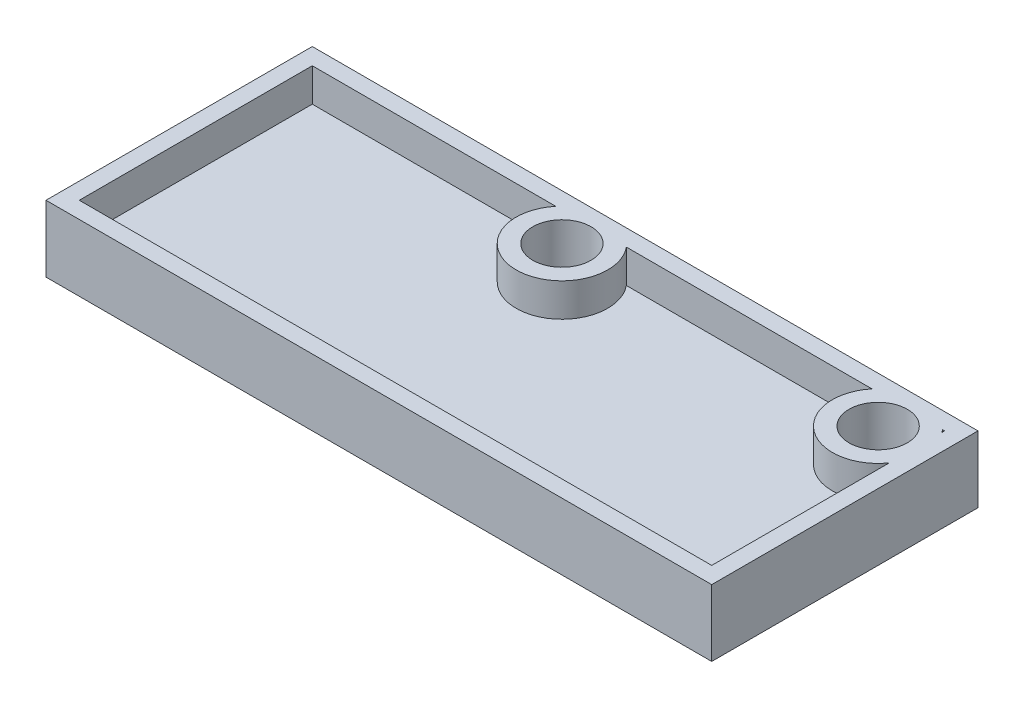
ISO-10303-21;
HEADER;
FILE_DESCRIPTION(('STEP AP214'),'2;1');
FILE_NAME('part.step','',(''),(''),'','','');
FILE_SCHEMA(('AUTOMOTIVE_DESIGN { 1 0 10303 214 1 1 1 1 }'));
ENDSEC;
DATA;
#1=APPLICATION_CONTEXT('core data for automotive mechanical design processes');
#2=APPLICATION_PROTOCOL_DEFINITION('international standard','automotive_design',2000,#1);
#3=PRODUCT_CONTEXT('',#1,'mechanical');
#4=PRODUCT('Part','Part','',(#3));
#5=PRODUCT_RELATED_PRODUCT_CATEGORY('part','',(#4));
#6=PRODUCT_DEFINITION_FORMATION('','',#4);
#7=PRODUCT_DEFINITION_CONTEXT('part definition',#1,'design');
#8=PRODUCT_DEFINITION('design','',#6,#7);
#9=PRODUCT_DEFINITION_SHAPE('','',#8);
#10=(LENGTH_UNIT() NAMED_UNIT(*) SI_UNIT(.MILLI.,.METRE.));
#11=(NAMED_UNIT(*) PLANE_ANGLE_UNIT() SI_UNIT($,.RADIAN.));
#12=(NAMED_UNIT(*) SI_UNIT($,.STERADIAN.) SOLID_ANGLE_UNIT());
#13=UNCERTAINTY_MEASURE_WITH_UNIT(LENGTH_MEASURE(1.E-05),#10,'distance_accuracy_value','');
#14=(GEOMETRIC_REPRESENTATION_CONTEXT(3) GLOBAL_UNCERTAINTY_ASSIGNED_CONTEXT((#13)) GLOBAL_UNIT_ASSIGNED_CONTEXT((#10,
#11,#12)) REPRESENTATION_CONTEXT('',''));
#15=CARTESIAN_POINT('',(0.,0.,0.));
#16=DIRECTION('',(0.,0.,1.));
#17=DIRECTION('',(1.,0.,0.));
#18=AXIS2_PLACEMENT_3D('',#15,#16,#17);
#19=CARTESIAN_POINT('',(1.,4.,-15.));
#20=DIRECTION('',(0.,0.,1.));
#21=DIRECTION('',(1.,0.,0.));
#22=AXIS2_PLACEMENT_3D('',#19,#20,#21);
#23=PLANE('',#22);
#24=DIRECTION('',(0.,1.,0.));
#25=VECTOR('',#24,1.);
#26=CARTESIAN_POINT('',(38.8713203435597,-0.00200000000000027,-15.));
#27=LINE('',#26,#25);
#28=CARTESIAN_POINT('',(38.8713203435597,2.,-15.));
#29=VERTEX_POINT('',#28);
#30=CARTESIAN_POINT('',(38.8713203435597,4.,-15.));
#31=VERTEX_POINT('',#30);
#32=EDGE_CURVE('E203',#29,#31,#27,.T.);
#33=ORIENTED_EDGE('',*,*,#32,.F.);
#34=DIRECTION('',(-1.,0.,0.));
#35=VECTOR('',#34,1.);
#36=CARTESIAN_POINT('',(1.,2.,-15.));
#37=LINE('',#36,#35);
#38=CARTESIAN_POINT('',(39.,2.,-15.));
#39=VERTEX_POINT('',#38);
#40=EDGE_CURVE('E217',#39,#29,#37,.T.);
#41=ORIENTED_EDGE('',*,*,#40,.F.);
#42=DIRECTION('',(0.,-1.,0.));
#43=VECTOR('',#42,1.);
#44=CARTESIAN_POINT('',(39.,4.,-15.));
#45=LINE('',#44,#43);
#46=CARTESIAN_POINT('',(39.,4.,-15.));
#47=VERTEX_POINT('',#46);
#48=EDGE_CURVE('E241',#47,#39,#45,.T.);
#49=ORIENTED_EDGE('',*,*,#48,.F.);
#50=DIRECTION('',(-1.,0.,0.));
#51=VECTOR('',#50,1.);
#52=CARTESIAN_POINT('',(1.,4.,-15.));
#53=LINE('',#52,#51);
#54=EDGE_CURVE('E219',#47,#31,#53,.T.);
#55=ORIENTED_EDGE('',*,*,#54,.T.);
#56=EDGE_LOOP('',(#33,#41,#49,#55));
#57=FACE_BOUND('',#56,.T.);
#58=ADVANCED_FACE('F96',(#57),#23,.T.);
#59=CARTESIAN_POINT('',(39.,4.,-0.999999999999999));
#60=DIRECTION('',(-1.,0.,0.));
#61=DIRECTION('',(0.,0.,1.));
#62=AXIS2_PLACEMENT_3D('',#59,#60,#61);
#63=PLANE('',#62);
#64=DIRECTION('',(0.,1.,0.));
#65=VECTOR('',#64,1.);
#66=CARTESIAN_POINT('',(39.,-0.00200000000000027,-11.6688611699158));
#67=LINE('',#66,#65);
#68=CARTESIAN_POINT('',(39.,2.,-11.6688611699158));
#69=VERTEX_POINT('',#68);
#70=CARTESIAN_POINT('',(39.,4.,-11.6688611699158));
#71=VERTEX_POINT('',#70);
#72=EDGE_CURVE('E374',#69,#71,#67,.T.);
#73=ORIENTED_EDGE('',*,*,#72,.F.);
#74=DIRECTION('',(0.,0.,-1.));
#75=VECTOR('',#74,1.);
#76=CARTESIAN_POINT('',(39.,2.,-0.999999999999999));
#77=LINE('',#76,#75);
#78=CARTESIAN_POINT('',(39.,2.,-0.999999999999999));
#79=VERTEX_POINT('',#78);
#80=EDGE_CURVE('E234',#79,#69,#77,.T.);
#81=ORIENTED_EDGE('',*,*,#80,.F.);
#82=DIRECTION('',(0.,-1.,0.));
#83=VECTOR('',#82,1.);
#84=CARTESIAN_POINT('',(39.,4.,-0.999999999999999));
#85=LINE('',#84,#83);
#86=CARTESIAN_POINT('',(39.,4.,-0.999999999999999));
#87=VERTEX_POINT('',#86);
#88=EDGE_CURVE('E243',#87,#79,#85,.T.);
#89=ORIENTED_EDGE('',*,*,#88,.F.);
#90=DIRECTION('',(0.,0.,-1.));
#91=VECTOR('',#90,1.);
#92=CARTESIAN_POINT('',(39.,4.,-0.999999999999999));
#93=LINE('',#92,#91);
#94=EDGE_CURVE('E339',#87,#71,#93,.T.);
#95=ORIENTED_EDGE('',*,*,#94,.T.);
#96=EDGE_LOOP('',(#73,#81,#89,#95));
#97=FACE_BOUND('',#96,.T.);
#98=ADVANCED_FACE('F301',(#97),#63,.T.);
#99=CARTESIAN_POINT('',(0.,2.,0.));
#100=DIRECTION('',(0.,-1.,0.));
#101=DIRECTION('',(0.,0.,-1.));
#102=AXIS2_PLACEMENT_3D('',#99,#100,#101);
#103=PLANE('',#102);
#104=ORIENTED_EDGE('',*,*,#40,.T.);
#105=CARTESIAN_POINT('',(36.75,2.,-13.25));
#106=DIRECTION('',(0.,-1.,0.));
#107=DIRECTION('',(0.,0.,-1.));
#108=AXIS2_PLACEMENT_3D('',#105,#106,#107);
#109=CIRCLE('',#108,2.74999999999999);
#110=CARTESIAN_POINT('',(39.,2.,-14.8311388300842));
#111=VERTEX_POINT('',#110);
#112=EDGE_CURVE('E200',#111,#29,#109,.F.);
#113=ORIENTED_EDGE('',*,*,#112,.F.);
#114=EDGE_CURVE('E223',#111,#39,#77,.T.);
#115=ORIENTED_EDGE('',*,*,#114,.T.);
#116=EDGE_LOOP('',(#104,#113,#115));
#117=FACE_BOUND('',#116,.T.);
#118=ADVANCED_FACE('F222',(#117),#103,.F.);
#119=DIRECTION('',(0.,1.,0.));
#120=VECTOR('',#119,1.);
#121=CARTESIAN_POINT('',(34.6286796564404,-0.00200000000000027,-15.));
#122=LINE('',#121,#120);
#123=CARTESIAN_POINT('',(34.6286796564404,4.,-15.));
#124=VERTEX_POINT('',#123);
#125=CARTESIAN_POINT('',(34.6286796564404,2.,-15.));
#126=VERTEX_POINT('',#125);
#127=EDGE_CURVE('E114',#124,#126,#122,.F.);
#128=ORIENTED_EDGE('',*,*,#127,.F.);
#129=CARTESIAN_POINT('',(19.8713203435596,4.,-15.));
#130=VERTEX_POINT('',#129);
#131=EDGE_CURVE('E338',#124,#130,#53,.T.);
#132=ORIENTED_EDGE('',*,*,#131,.T.);
#133=DIRECTION('',(0.,1.,0.));
#134=VECTOR('',#133,1.);
#135=CARTESIAN_POINT('',(19.8713203435596,-0.00200000000000027,-15.));
#136=LINE('',#135,#134);
#137=CARTESIAN_POINT('',(19.8713203435596,2.,-15.));
#138=VERTEX_POINT('',#137);
#139=EDGE_CURVE('E329',#138,#130,#136,.T.);
#140=ORIENTED_EDGE('',*,*,#139,.F.);
#141=EDGE_CURVE('E100',#126,#138,#37,.T.);
#142=ORIENTED_EDGE('',*,*,#141,.F.);
#143=EDGE_LOOP('',(#128,#132,#140,#142));
#144=FACE_BOUND('',#143,.T.);
#145=ADVANCED_FACE('F299',(#144),#23,.T.);
#146=CARTESIAN_POINT('',(0.,2.,0.));
#147=DIRECTION('',(1.,0.,0.));
#148=DIRECTION('',(0.,0.,-1.));
#149=AXIS2_PLACEMENT_3D('',#146,#147,#148);
#150=PLANE('',#149);
#151=DIRECTION('',(0.,0.,1.));
#152=VECTOR('',#151,1.);
#153=CARTESIAN_POINT('',(0.,0.,0.));
#154=LINE('',#153,#152);
#155=CARTESIAN_POINT('',(0.,0.,-16.));
#156=VERTEX_POINT('',#155);
#157=CARTESIAN_POINT('',(0.,0.,0.));
#158=VERTEX_POINT('',#157);
#159=EDGE_CURVE('E259',#156,#158,#154,.T.);
#160=ORIENTED_EDGE('',*,*,#159,.T.);
#161=DIRECTION('',(0.,-1.,0.));
#162=VECTOR('',#161,1.);
#163=CARTESIAN_POINT('',(0.,2.,0.));
#164=LINE('',#163,#162);
#165=CARTESIAN_POINT('',(0.,4.,0.));
#166=VERTEX_POINT('',#165);
#167=EDGE_CURVE('E12',#166,#158,#164,.T.);
#168=ORIENTED_EDGE('',*,*,#167,.F.);
#169=DIRECTION('',(0.,0.,1.));
#170=VECTOR('',#169,1.);
#171=CARTESIAN_POINT('',(0.,4.,0.));
#172=LINE('',#171,#170);
#173=CARTESIAN_POINT('',(0.,4.,-16.));
#174=VERTEX_POINT('',#173);
#175=EDGE_CURVE('E248',#174,#166,#172,.T.);
#176=ORIENTED_EDGE('',*,*,#175,.F.);
#177=DIRECTION('',(0.,-1.,0.));
#178=VECTOR('',#177,1.);
#179=CARTESIAN_POINT('',(0.,2.,-16.));
#180=LINE('',#179,#178);
#181=EDGE_CURVE('E268',#174,#156,#180,.T.);
#182=ORIENTED_EDGE('',*,*,#181,.T.);
#183=EDGE_LOOP('',(#160,#168,#176,#182));
#184=FACE_BOUND('',#183,.T.);
#185=ADVANCED_FACE('F98',(#184),#150,.F.);
#186=CARTESIAN_POINT('',(0.,2.,0.));
#187=DIRECTION('',(0.,0.,-1.));
#188=DIRECTION('',(-1.,0.,0.));
#189=AXIS2_PLACEMENT_3D('',#186,#187,#188);
#190=PLANE('',#189);
#191=DIRECTION('',(1.,0.,0.));
#192=VECTOR('',#191,1.);
#193=CARTESIAN_POINT('',(0.,0.,0.));
#194=LINE('',#193,#192);
#195=CARTESIAN_POINT('',(40.,0.,0.));
#196=VERTEX_POINT('',#195);
#197=EDGE_CURVE('E262',#158,#196,#194,.T.);
#198=ORIENTED_EDGE('',*,*,#197,.T.);
#199=DIRECTION('',(0.,-1.,0.));
#200=VECTOR('',#199,1.);
#201=CARTESIAN_POINT('',(40.,2.,0.));
#202=LINE('',#201,#200);
#203=CARTESIAN_POINT('',(40.,4.,0.));
#204=VERTEX_POINT('',#203);
#205=EDGE_CURVE('E106',#204,#196,#202,.T.);
#206=ORIENTED_EDGE('',*,*,#205,.F.);
#207=DIRECTION('',(1.,0.,0.));
#208=VECTOR('',#207,1.);
#209=CARTESIAN_POINT('',(0.,4.,0.));
#210=LINE('',#209,#208);
#211=EDGE_CURVE('E251',#166,#204,#210,.T.);
#212=ORIENTED_EDGE('',*,*,#211,.F.);
#213=ORIENTED_EDGE('',*,*,#167,.T.);
#214=EDGE_LOOP('',(#198,#206,#212,#213));
#215=FACE_BOUND('',#214,.T.);
#216=ADVANCED_FACE('F292',(#215),#190,.F.);
#217=CARTESIAN_POINT('',(40.,2.,0.));
#218=DIRECTION('',(-1.,0.,0.));
#219=DIRECTION('',(0.,0.,1.));
#220=AXIS2_PLACEMENT_3D('',#217,#218,#219);
#221=PLANE('',#220);
#222=DIRECTION('',(0.,0.,-1.));
#223=VECTOR('',#222,1.);
#224=CARTESIAN_POINT('',(40.,0.,0.));
#225=LINE('',#224,#223);
#226=CARTESIAN_POINT('',(40.,0.,-16.));
#227=VERTEX_POINT('',#226);
#228=EDGE_CURVE('E264',#196,#227,#225,.T.);
#229=ORIENTED_EDGE('',*,*,#228,.T.);
#230=DIRECTION('',(0.,-1.,0.));
#231=VECTOR('',#230,1.);
#232=CARTESIAN_POINT('',(40.,2.,-16.));
#233=LINE('',#232,#231);
#234=CARTESIAN_POINT('',(40.,4.,-16.));
#235=VERTEX_POINT('',#234);
#236=EDGE_CURVE('E271',#235,#227,#233,.T.);
#237=ORIENTED_EDGE('',*,*,#236,.F.);
#238=DIRECTION('',(0.,0.,-1.));
#239=VECTOR('',#238,1.);
#240=CARTESIAN_POINT('',(40.,4.,0.));
#241=LINE('',#240,#239);
#242=EDGE_CURVE('E254',#204,#235,#241,.T.);
#243=ORIENTED_EDGE('',*,*,#242,.F.);
#244=ORIENTED_EDGE('',*,*,#205,.T.);
#245=EDGE_LOOP('',(#229,#237,#243,#244));
#246=FACE_BOUND('',#245,.T.);
#247=ADVANCED_FACE('F277',(#246),#221,.F.);
#248=CARTESIAN_POINT('',(0.,2.,-16.));
#249=DIRECTION('',(0.,0.,1.));
#250=DIRECTION('',(1.,0.,0.));
#251=AXIS2_PLACEMENT_3D('',#248,#249,#250);
#252=PLANE('',#251);
#253=DIRECTION('',(-1.,0.,0.));
#254=VECTOR('',#253,1.);
#255=CARTESIAN_POINT('',(0.,0.,-16.));
#256=LINE('',#255,#254);
#257=EDGE_CURVE('E266',#227,#156,#256,.T.);
#258=ORIENTED_EDGE('',*,*,#257,.T.);
#259=ORIENTED_EDGE('',*,*,#181,.F.);
#260=DIRECTION('',(-1.,0.,0.));
#261=VECTOR('',#260,1.);
#262=CARTESIAN_POINT('',(0.,4.,-16.));
#263=LINE('',#262,#261);
#264=EDGE_CURVE('E257',#235,#174,#263,.T.);
#265=ORIENTED_EDGE('',*,*,#264,.F.);
#266=ORIENTED_EDGE('',*,*,#236,.T.);
#267=EDGE_LOOP('',(#258,#259,#265,#266));
#268=FACE_BOUND('',#267,.T.);
#269=ADVANCED_FACE('F286',(#268),#252,.F.);
#270=CARTESIAN_POINT('',(0.,0.,0.));
#271=DIRECTION('',(0.,-1.,0.));
#272=DIRECTION('',(0.,0.,-1.));
#273=AXIS2_PLACEMENT_3D('',#270,#271,#272);
#274=PLANE('',#273);
#275=CARTESIAN_POINT('',(17.75,0.,-13.25));
#276=DIRECTION('',(0.,1.,0.));
#277=DIRECTION('',(0.,0.,1.));
#278=AXIS2_PLACEMENT_3D('',#275,#276,#277);
#279=CIRCLE('',#278,1.75);
#280=CARTESIAN_POINT('',(17.75,0.,-11.5));
#281=VERTEX_POINT('',#280);
#282=EDGE_CURVE('E211',#281,#281,#279,.T.);
#283=ORIENTED_EDGE('',*,*,#282,.T.);
#284=EDGE_LOOP('',(#283));
#285=FACE_BOUND('',#284,.T.);
#286=CARTESIAN_POINT('',(36.75,0.,-13.25));
#287=DIRECTION('',(0.,1.,0.));
#288=DIRECTION('',(0.,0.,1.));
#289=AXIS2_PLACEMENT_3D('',#286,#287,#288);
#290=CIRCLE('',#289,1.75);
#291=CARTESIAN_POINT('',(36.75,0.,-11.5));
#292=VERTEX_POINT('',#291);
#293=EDGE_CURVE('E382',#292,#292,#290,.T.);
#294=ORIENTED_EDGE('',*,*,#293,.T.);
#295=EDGE_LOOP('',(#294));
#296=FACE_BOUND('',#295,.T.);
#297=ORIENTED_EDGE('',*,*,#159,.F.);
#298=ORIENTED_EDGE('',*,*,#257,.F.);
#299=ORIENTED_EDGE('',*,*,#228,.F.);
#300=ORIENTED_EDGE('',*,*,#197,.F.);
#301=EDGE_LOOP('',(#297,#298,#299,#300));
#302=FACE_BOUND('',#301,.T.);
#303=ADVANCED_FACE('F283',(#285,#296,#302),#274,.T.);
#304=CARTESIAN_POINT('',(0.,4.,0.));
#305=DIRECTION('',(0.,-1.,0.));
#306=DIRECTION('',(0.,0.,-1.));
#307=AXIS2_PLACEMENT_3D('',#304,#305,#306);
#308=PLANE('',#307);
#309=CARTESIAN_POINT('',(17.75,4.,-13.25));
#310=DIRECTION('',(0.,1.,0.));
#311=DIRECTION('',(0.,0.,1.));
#312=AXIS2_PLACEMENT_3D('',#309,#310,#311);
#313=CIRCLE('',#312,1.75);
#314=CARTESIAN_POINT('',(17.75,4.,-11.5));
#315=VERTEX_POINT('',#314);
#316=EDGE_CURVE('E388',#315,#315,#313,.T.);
#317=ORIENTED_EDGE('',*,*,#316,.F.);
#318=EDGE_LOOP('',(#317));
#319=FACE_BOUND('',#318,.T.);
#320=CARTESIAN_POINT('',(36.75,4.,-13.25));
#321=DIRECTION('',(0.,1.,0.));
#322=DIRECTION('',(0.,0.,1.));
#323=AXIS2_PLACEMENT_3D('',#320,#321,#322);
#324=CIRCLE('',#323,1.75);
#325=CARTESIAN_POINT('',(36.75,4.,-11.5));
#326=VERTEX_POINT('',#325);
#327=EDGE_CURVE('E385',#326,#326,#324,.T.);
#328=ORIENTED_EDGE('',*,*,#327,.F.);
#329=EDGE_LOOP('',(#328));
#330=FACE_BOUND('',#329,.T.);
#331=ORIENTED_EDGE('',*,*,#131,.F.);
#332=CARTESIAN_POINT('',(36.75,4.,-13.25));
#333=DIRECTION('',(0.,1.,0.));
#334=DIRECTION('',(0.,0.,1.));
#335=AXIS2_PLACEMENT_3D('',#332,#333,#334);
#336=CIRCLE('',#335,2.74999999999999);
#337=EDGE_CURVE('E378',#124,#71,#336,.T.);
#338=ORIENTED_EDGE('',*,*,#337,.T.);
#339=ORIENTED_EDGE('',*,*,#94,.F.);
#340=DIRECTION('',(1.,0.,0.));
#341=VECTOR('',#340,1.);
#342=CARTESIAN_POINT('',(1.,4.,-0.999999999999999));
#343=LINE('',#342,#341);
#344=CARTESIAN_POINT('',(1.,4.,-0.999999999999999));
#345=VERTEX_POINT('',#344);
#346=EDGE_CURVE('E227',#345,#87,#343,.T.);
#347=ORIENTED_EDGE('',*,*,#346,.F.);
#348=DIRECTION('',(0.,0.,1.));
#349=VECTOR('',#348,1.);
#350=CARTESIAN_POINT('',(1.,4.,-0.999999999999999));
#351=LINE('',#350,#349);
#352=CARTESIAN_POINT('',(1.,4.,-15.));
#353=VERTEX_POINT('',#352);
#354=EDGE_CURVE('E225',#353,#345,#351,.T.);
#355=ORIENTED_EDGE('',*,*,#354,.F.);
#356=CARTESIAN_POINT('',(15.6286796564404,4.,-15.));
#357=VERTEX_POINT('',#356);
#358=EDGE_CURVE('E327',#357,#353,#53,.T.);
#359=ORIENTED_EDGE('',*,*,#358,.F.);
#360=CARTESIAN_POINT('',(17.75,4.,-13.25));
#361=DIRECTION('',(0.,1.,0.));
#362=DIRECTION('',(0.,0.,1.));
#363=AXIS2_PLACEMENT_3D('',#360,#361,#362);
#364=CIRCLE('',#363,2.75);
#365=EDGE_CURVE('E330',#357,#130,#364,.T.);
#366=ORIENTED_EDGE('',*,*,#365,.T.);
#367=EDGE_LOOP('',(#331,#338,#339,#347,#355,#359,#366));
#368=FACE_BOUND('',#367,.T.);
#369=CARTESIAN_POINT('',(39.,4.,-14.8311388300842));
#370=VERTEX_POINT('',#369);
#371=EDGE_CURVE('E377',#370,#31,#336,.T.);
#372=ORIENTED_EDGE('',*,*,#371,.T.);
#373=ORIENTED_EDGE('',*,*,#54,.F.);
#374=EDGE_CURVE('E342',#370,#47,#93,.T.);
#375=ORIENTED_EDGE('',*,*,#374,.F.);
#376=EDGE_LOOP('',(#372,#373,#375));
#377=FACE_BOUND('',#376,.T.);
#378=ORIENTED_EDGE('',*,*,#264,.T.);
#379=ORIENTED_EDGE('',*,*,#175,.T.);
#380=ORIENTED_EDGE('',*,*,#211,.T.);
#381=ORIENTED_EDGE('',*,*,#242,.T.);
#382=EDGE_LOOP('',(#378,#379,#380,#381));
#383=FACE_BOUND('',#382,.T.);
#384=ADVANCED_FACE('F291',(#319,#330,#368,#377,#383),#308,.F.);
#385=CARTESIAN_POINT('',(1.,4.,-0.999999999999999));
#386=DIRECTION('',(1.,0.,0.));
#387=DIRECTION('',(0.,0.,-1.));
#388=AXIS2_PLACEMENT_3D('',#385,#386,#387);
#389=PLANE('',#388);
#390=DIRECTION('',(0.,0.,1.));
#391=VECTOR('',#390,1.);
#392=CARTESIAN_POINT('',(1.,2.,-0.999999999999999));
#393=LINE('',#392,#391);
#394=CARTESIAN_POINT('',(1.,2.,-15.));
#395=VERTEX_POINT('',#394);
#396=CARTESIAN_POINT('',(1.,2.,-0.999999999999999));
#397=VERTEX_POINT('',#396);
#398=EDGE_CURVE('E346',#395,#397,#393,.T.);
#399=ORIENTED_EDGE('',*,*,#398,.F.);
#400=DIRECTION('',(0.,-1.,0.));
#401=VECTOR('',#400,1.);
#402=CARTESIAN_POINT('',(1.,4.,-15.));
#403=LINE('',#402,#401);
#404=EDGE_CURVE('E236',#353,#395,#403,.T.);
#405=ORIENTED_EDGE('',*,*,#404,.F.);
#406=ORIENTED_EDGE('',*,*,#354,.T.);
#407=DIRECTION('',(0.,-1.,0.));
#408=VECTOR('',#407,1.);
#409=CARTESIAN_POINT('',(1.,4.,-0.999999999999999));
#410=LINE('',#409,#408);
#411=EDGE_CURVE('E245',#345,#397,#410,.T.);
#412=ORIENTED_EDGE('',*,*,#411,.T.);
#413=EDGE_LOOP('',(#399,#405,#406,#412));
#414=FACE_BOUND('',#413,.T.);
#415=ADVANCED_FACE('F354',(#414),#389,.T.);
#416=CARTESIAN_POINT('',(1.,4.,-0.999999999999999));
#417=DIRECTION('',(0.,0.,-1.));
#418=DIRECTION('',(-1.,0.,0.));
#419=AXIS2_PLACEMENT_3D('',#416,#417,#418);
#420=PLANE('',#419);
#421=DIRECTION('',(1.,0.,0.));
#422=VECTOR('',#421,1.);
#423=CARTESIAN_POINT('',(1.,2.,-0.999999999999999));
#424=LINE('',#423,#422);
#425=EDGE_CURVE('E348',#397,#79,#424,.T.);
#426=ORIENTED_EDGE('',*,*,#425,.F.);
#427=ORIENTED_EDGE('',*,*,#411,.F.);
#428=ORIENTED_EDGE('',*,*,#346,.T.);
#429=ORIENTED_EDGE('',*,*,#88,.T.);
#430=EDGE_LOOP('',(#426,#427,#428,#429));
#431=FACE_BOUND('',#430,.T.);
#432=ADVANCED_FACE('F323',(#431),#420,.T.);
#433=DIRECTION('',(0.,1.,0.));
#434=VECTOR('',#433,1.);
#435=CARTESIAN_POINT('',(39.,-0.00200000000000027,-14.8311388300842));
#436=LINE('',#435,#434);
#437=EDGE_CURVE('E206',#370,#111,#436,.F.);
#438=ORIENTED_EDGE('',*,*,#437,.F.);
#439=ORIENTED_EDGE('',*,*,#374,.T.);
#440=ORIENTED_EDGE('',*,*,#48,.T.);
#441=ORIENTED_EDGE('',*,*,#114,.F.);
#442=EDGE_LOOP('',(#438,#439,#440,#441));
#443=FACE_BOUND('',#442,.T.);
#444=ADVANCED_FACE('F309',(#443),#63,.T.);
#445=DIRECTION('',(0.,1.,0.));
#446=VECTOR('',#445,1.);
#447=CARTESIAN_POINT('',(15.6286796564404,-0.00200000000000027,-15.));
#448=LINE('',#447,#446);
#449=CARTESIAN_POINT('',(15.6286796564404,2.,-15.));
#450=VERTEX_POINT('',#449);
#451=EDGE_CURVE('E122',#357,#450,#448,.F.);
#452=ORIENTED_EDGE('',*,*,#451,.F.);
#453=ORIENTED_EDGE('',*,*,#358,.T.);
#454=ORIENTED_EDGE('',*,*,#404,.T.);
#455=EDGE_CURVE('E229',#450,#395,#37,.T.);
#456=ORIENTED_EDGE('',*,*,#455,.F.);
#457=EDGE_LOOP('',(#452,#453,#454,#456));
#458=FACE_BOUND('',#457,.T.);
#459=ADVANCED_FACE('F303',(#458),#23,.T.);
#460=ORIENTED_EDGE('',*,*,#80,.T.);
#461=EDGE_CURVE('E210',#126,#69,#109,.F.);
#462=ORIENTED_EDGE('',*,*,#461,.F.);
#463=ORIENTED_EDGE('',*,*,#141,.T.);
#464=CARTESIAN_POINT('',(17.75,2.,-13.25));
#465=DIRECTION('',(0.,-1.,0.));
#466=DIRECTION('',(0.,0.,-1.));
#467=AXIS2_PLACEMENT_3D('',#464,#465,#466);
#468=CIRCLE('',#467,2.75);
#469=EDGE_CURVE('E220',#450,#138,#468,.F.);
#470=ORIENTED_EDGE('',*,*,#469,.F.);
#471=ORIENTED_EDGE('',*,*,#455,.T.);
#472=ORIENTED_EDGE('',*,*,#398,.T.);
#473=ORIENTED_EDGE('',*,*,#425,.T.);
#474=EDGE_LOOP('',(#460,#462,#463,#470,#471,#472,#473));
#475=FACE_BOUND('',#474,.T.);
#476=ADVANCED_FACE('F314',(#475),#103,.F.);
#477=CARTESIAN_POINT('',(17.75,-0.00200000000000027,-13.25));
#478=DIRECTION('',(0.,1.,0.));
#479=DIRECTION('',(0.,0.,1.));
#480=AXIS2_PLACEMENT_3D('',#477,#478,#479);
#481=CYLINDRICAL_SURFACE('',#480,2.75);
#482=ORIENTED_EDGE('',*,*,#469,.T.);
#483=ORIENTED_EDGE('',*,*,#139,.T.);
#484=ORIENTED_EDGE('',*,*,#365,.F.);
#485=ORIENTED_EDGE('',*,*,#451,.T.);
#486=EDGE_LOOP('',(#482,#483,#484,#485));
#487=FACE_BOUND('',#486,.T.);
#488=ADVANCED_FACE('F320',(#487),#481,.T.);
#489=CARTESIAN_POINT('',(36.75,-0.00200000000000027,-13.25));
#490=DIRECTION('',(0.,1.,0.));
#491=DIRECTION('',(0.,0.,1.));
#492=AXIS2_PLACEMENT_3D('',#489,#490,#491);
#493=CYLINDRICAL_SURFACE('',#492,2.74999999999999);
#494=ORIENTED_EDGE('',*,*,#337,.F.);
#495=ORIENTED_EDGE('',*,*,#127,.T.);
#496=ORIENTED_EDGE('',*,*,#461,.T.);
#497=ORIENTED_EDGE('',*,*,#72,.T.);
#498=EDGE_LOOP('',(#494,#495,#496,#497));
#499=FACE_BOUND('',#498,.T.);
#500=ADVANCED_FACE('F414',(#499),#493,.T.);
#501=ORIENTED_EDGE('',*,*,#112,.T.);
#502=ORIENTED_EDGE('',*,*,#32,.T.);
#503=ORIENTED_EDGE('',*,*,#371,.F.);
#504=ORIENTED_EDGE('',*,*,#437,.T.);
#505=EDGE_LOOP('',(#501,#502,#503,#504));
#506=FACE_BOUND('',#505,.T.);
#507=ADVANCED_FACE('F202',(#506),#493,.T.);
#508=CARTESIAN_POINT('',(36.75,0.,-13.25));
#509=DIRECTION('',(0.,1.,0.));
#510=DIRECTION('',(0.,0.,1.));
#511=AXIS2_PLACEMENT_3D('',#508,#509,#510);
#512=CYLINDRICAL_SURFACE('',#511,1.75);
#513=ORIENTED_EDGE('',*,*,#293,.F.);
#514=EDGE_LOOP('',(#513));
#515=FACE_BOUND('',#514,.T.);
#516=ORIENTED_EDGE('',*,*,#327,.T.);
#517=EDGE_LOOP('',(#516));
#518=FACE_BOUND('',#517,.T.);
#519=ADVANCED_FACE('F399',(#515,#518),#512,.F.);
#520=CARTESIAN_POINT('',(17.75,0.,-13.25));
#521=DIRECTION('',(0.,1.,0.));
#522=DIRECTION('',(0.,0.,1.));
#523=AXIS2_PLACEMENT_3D('',#520,#521,#522);
#524=CYLINDRICAL_SURFACE('',#523,1.75);
#525=ORIENTED_EDGE('',*,*,#282,.F.);
#526=EDGE_LOOP('',(#525));
#527=FACE_BOUND('',#526,.T.);
#528=ORIENTED_EDGE('',*,*,#316,.T.);
#529=EDGE_LOOP('',(#528));
#530=FACE_BOUND('',#529,.T.);
#531=ADVANCED_FACE('F396',(#527,#530),#524,.F.);
#532=CLOSED_SHELL('',(#58,#98,#118,#145,#185,#216,#247,#269,#303,#384,#415,#432,#444,#459,#476,
#488,#500,#507,#519,#531));
#533=MANIFOLD_SOLID_BREP('B2',#532);
#534=ADVANCED_BREP_SHAPE_REPRESENTATION('',(#18,#533),#14);
#535=SHAPE_DEFINITION_REPRESENTATION(#9,#534);
ENDSEC;
END-ISO-10303-21;
